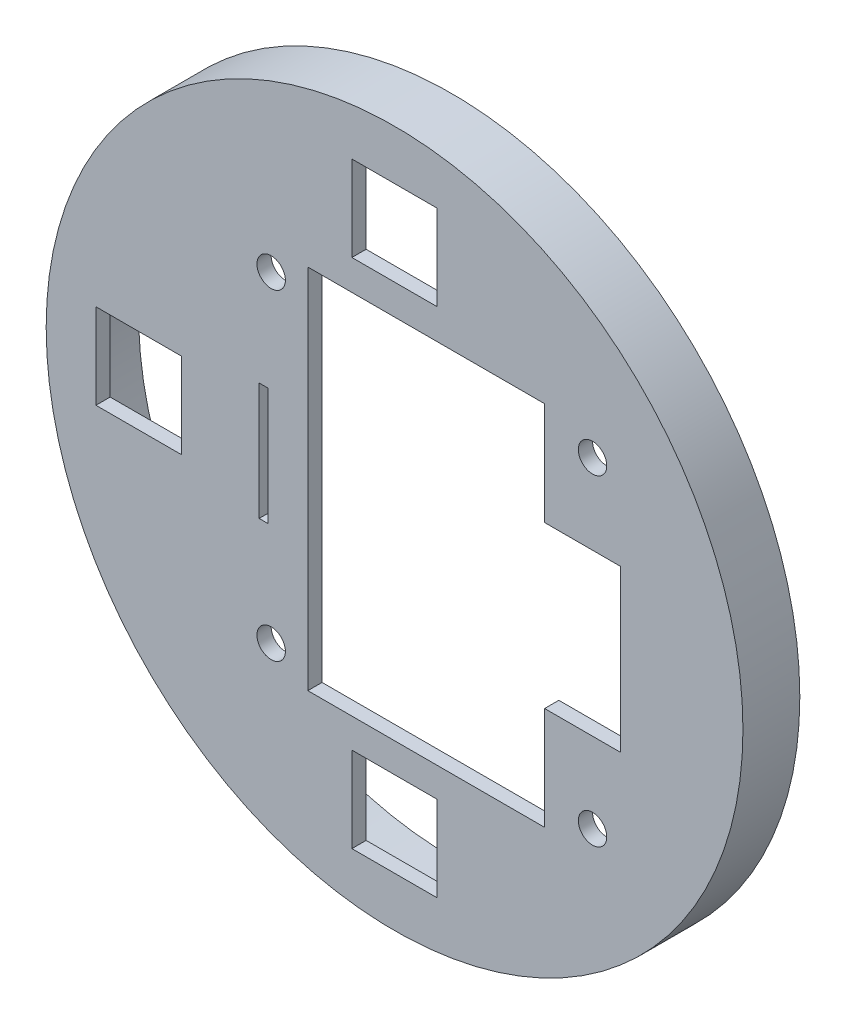
ISO-10303-21;
HEADER;
FILE_DESCRIPTION(('STEP AP214'),'2;1');
FILE_NAME('part.step','',(''),(''),'','','');
FILE_SCHEMA(('AUTOMOTIVE_DESIGN { 1 0 10303 214 1 1 1 1 }'));
ENDSEC;
DATA;
#1=APPLICATION_CONTEXT('core data for automotive mechanical design processes');
#2=APPLICATION_PROTOCOL_DEFINITION('international standard','automotive_design',2000,#1);
#3=PRODUCT_CONTEXT('',#1,'mechanical');
#4=PRODUCT('Part','Part','',(#3));
#5=PRODUCT_RELATED_PRODUCT_CATEGORY('part','',(#4));
#6=PRODUCT_DEFINITION_FORMATION('','',#4);
#7=PRODUCT_DEFINITION_CONTEXT('part definition',#1,'design');
#8=PRODUCT_DEFINITION('design','',#6,#7);
#9=PRODUCT_DEFINITION_SHAPE('','',#8);
#10=(LENGTH_UNIT() NAMED_UNIT(*) SI_UNIT(.MILLI.,.METRE.));
#11=(NAMED_UNIT(*) PLANE_ANGLE_UNIT() SI_UNIT($,.RADIAN.));
#12=(NAMED_UNIT(*) SI_UNIT($,.STERADIAN.) SOLID_ANGLE_UNIT());
#13=UNCERTAINTY_MEASURE_WITH_UNIT(LENGTH_MEASURE(1.E-05),#10,'distance_accuracy_value','');
#14=(GEOMETRIC_REPRESENTATION_CONTEXT(3) GLOBAL_UNCERTAINTY_ASSIGNED_CONTEXT((#13)) GLOBAL_UNIT_ASSIGNED_CONTEXT((#10,
#11,#12)) REPRESENTATION_CONTEXT('',''));
#15=CARTESIAN_POINT('',(0.,0.,0.));
#16=DIRECTION('',(0.,0.,1.));
#17=DIRECTION('',(1.,0.,0.));
#18=AXIS2_PLACEMENT_3D('',#15,#16,#17);
#19=CARTESIAN_POINT('',(0.,0.,0.5));
#20=DIRECTION('',(0.,0.,1.));
#21=DIRECTION('',(1.,0.,0.));
#22=AXIS2_PLACEMENT_3D('',#19,#20,#21);
#23=PLANE('',#22);
#24=DIRECTION('',(-1.,1.31260743015578E-13,0.));
#25=VECTOR('',#24,1.);
#26=CARTESIAN_POINT('',(-1.96891114523368E-12,-15.,0.5));
#27=LINE('',#26,#25);
#28=CARTESIAN_POINT('',(2.99999999999803,-15.0000000000004,0.5));
#29=VERTEX_POINT('',#28);
#30=CARTESIAN_POINT('',(-3.00000000000197,-14.9999999999996,0.5));
#31=VERTEX_POINT('',#30);
#32=EDGE_CURVE('E462',#29,#31,#27,.T.);
#33=ORIENTED_EDGE('',*,*,#32,.T.);
#34=DIRECTION('',(-1.31188462870746E-13,-1.,0.));
#35=VECTOR('',#34,1.);
#36=CARTESIAN_POINT('',(-3.,3.93565388612238E-13,0.5));
#37=LINE('',#36,#35);
#38=CARTESIAN_POINT('',(-3.00000000000275,-20.9999999999996,0.5));
#39=VERTEX_POINT('',#38);
#40=EDGE_CURVE('E509',#31,#39,#37,.T.);
#41=ORIENTED_EDGE('',*,*,#40,.T.);
#42=DIRECTION('',(-1.,1.30682501856919E-13,0.));
#43=VECTOR('',#42,1.);
#44=CARTESIAN_POINT('',(-2.74433253899531E-12,-21.,0.5));
#45=LINE('',#44,#43);
#46=CARTESIAN_POINT('',(2.99999999999725,-21.0000000000004,0.5));
#47=VERTEX_POINT('',#46);
#48=EDGE_CURVE('E504',#47,#39,#45,.T.);
#49=ORIENTED_EDGE('',*,*,#48,.F.);
#50=DIRECTION('',(-1.31188462870746E-13,-1.,0.));
#51=VECTOR('',#50,1.);
#52=CARTESIAN_POINT('',(3.,-3.93565388612239E-13,0.5));
#53=LINE('',#52,#51);
#54=EDGE_CURVE('E500',#29,#47,#53,.T.);
#55=ORIENTED_EDGE('',*,*,#54,.F.);
#56=EDGE_LOOP('',(#33,#41,#49,#55));
#57=FACE_BOUND('',#56,.T.);
#58=DIRECTION('',(0.,1.,0.));
#59=VECTOR('',#58,1.);
#60=CARTESIAN_POINT('',(15.8999999999996,0.,0.5));
#61=LINE('',#60,#59);
#62=CARTESIAN_POINT('',(15.8999999999996,-5.69106739326511,0.5));
#63=VERTEX_POINT('',#62);
#64=CARTESIAN_POINT('',(15.8999999999997,5.63243392589838,0.5));
#65=VERTEX_POINT('',#64);
#66=EDGE_CURVE('E530',#63,#65,#61,.T.);
#67=ORIENTED_EDGE('',*,*,#66,.T.);
#68=DIRECTION('',(1.,0.,0.));
#69=VECTOR('',#68,1.);
#70=CARTESIAN_POINT('',(0.,5.63243392589843,0.5));
#71=LINE('',#70,#69);
#72=CARTESIAN_POINT('',(10.5521111111108,5.6324339258984,0.5));
#73=VERTEX_POINT('',#72);
#74=EDGE_CURVE('E292',#73,#65,#71,.T.);
#75=ORIENTED_EDGE('',*,*,#74,.F.);
#76=DIRECTION('',(0.,-1.,0.));
#77=VECTOR('',#76,1.);
#78=CARTESIAN_POINT('',(10.5521111111108,0.,0.5));
#79=LINE('',#78,#77);
#80=CARTESIAN_POINT('',(10.5521111111108,12.8706832663167,0.5));
#81=VERTEX_POINT('',#80);
#82=EDGE_CURVE('E302',#81,#73,#79,.T.);
#83=ORIENTED_EDGE('',*,*,#82,.F.);
#84=DIRECTION('',(1.,0.,0.));
#85=VECTOR('',#84,1.);
#86=CARTESIAN_POINT('',(0.,12.8706832663167,0.5));
#87=LINE('',#86,#85);
#88=CARTESIAN_POINT('',(-6.09788888888919,12.8706832663167,0.5));
#89=VERTEX_POINT('',#88);
#90=EDGE_CURVE('E289',#89,#81,#87,.T.);
#91=ORIENTED_EDGE('',*,*,#90,.F.);
#92=DIRECTION('',(0.,1.,0.));
#93=VECTOR('',#92,1.);
#94=CARTESIAN_POINT('',(-6.09788888888922,0.,0.5));
#95=LINE('',#94,#93);
#96=CARTESIAN_POINT('',(-6.09788888888924,-12.9293167336833,0.5));
#97=VERTEX_POINT('',#96);
#98=EDGE_CURVE('E296',#97,#89,#95,.T.);
#99=ORIENTED_EDGE('',*,*,#98,.F.);
#100=DIRECTION('',(-1.,0.,0.));
#101=VECTOR('',#100,1.);
#102=CARTESIAN_POINT('',(0.,-12.9293167336833,0.5));
#103=LINE('',#102,#101);
#104=CARTESIAN_POINT('',(10.5521111111107,-12.9293167336833,0.5));
#105=VERTEX_POINT('',#104);
#106=EDGE_CURVE('E286',#105,#97,#103,.T.);
#107=ORIENTED_EDGE('',*,*,#106,.F.);
#108=CARTESIAN_POINT('',(10.5521111111108,-5.6910673932651,0.5));
#109=VERTEX_POINT('',#108);
#110=EDGE_CURVE('E299',#109,#105,#79,.T.);
#111=ORIENTED_EDGE('',*,*,#110,.F.);
#112=DIRECTION('',(-1.,0.,0.));
#113=VECTOR('',#112,1.);
#114=CARTESIAN_POINT('',(0.,-5.69106739326508,0.5));
#115=LINE('',#114,#113);
#116=EDGE_CURVE('E303',#63,#109,#115,.T.);
#117=ORIENTED_EDGE('',*,*,#116,.F.);
#118=EDGE_LOOP('',(#67,#75,#83,#91,#99,#107,#111,#117));
#119=FACE_BOUND('',#118,.T.);
#120=DIRECTION('',(1.,0.,0.));
#121=VECTOR('',#120,1.);
#122=CARTESIAN_POINT('',(0.,-4.15463792916986,0.5));
#123=LINE('',#122,#121);
#124=CARTESIAN_POINT('',(-9.52288888888902,-4.15463788618194,0.499999999998404));
#125=VERTEX_POINT('',#124);
#126=CARTESIAN_POINT('',(-8.89288888888902,-4.15463792916983,0.5));
#127=VERTEX_POINT('',#126);
#128=EDGE_CURVE('E260',#125,#127,#123,.T.);
#129=ORIENTED_EDGE('',*,*,#128,.T.);
#130=DIRECTION('',(0.,1.,0.));
#131=VECTOR('',#130,1.);
#132=CARTESIAN_POINT('',(-8.89288888888901,0.,0.5));
#133=LINE('',#132,#131);
#134=CARTESIAN_POINT('',(-8.892888888889,4.09536209232399,0.5));
#135=VERTEX_POINT('',#134);
#136=EDGE_CURVE('E115',#127,#135,#133,.T.);
#137=ORIENTED_EDGE('',*,*,#136,.T.);
#138=DIRECTION('',(-1.,0.,0.));
#139=VECTOR('',#138,1.);
#140=CARTESIAN_POINT('',(0.,4.09536207083015,0.5));
#141=LINE('',#140,#139);
#142=CARTESIAN_POINT('',(-9.522888888889,4.09536209232399,0.499999999999987));
#143=VERTEX_POINT('',#142);
#144=EDGE_CURVE('E11',#135,#143,#141,.T.);
#145=ORIENTED_EDGE('',*,*,#144,.T.);
#146=DIRECTION('',(0.,-1.,0.));
#147=VECTOR('',#146,1.);
#148=CARTESIAN_POINT('',(-9.52288888888901,0.,0.499999999999987));
#149=LINE('',#148,#147);
#150=EDGE_CURVE('E85',#143,#125,#149,.T.);
#151=ORIENTED_EDGE('',*,*,#150,.T.);
#152=EDGE_LOOP('',(#129,#137,#145,#151));
#153=FACE_BOUND('',#152,.T.);
#154=CARTESIAN_POINT('',(-8.67788888999997,11.2706832663167,0.5));
#155=DIRECTION('',(0.,0.,1.));
#156=DIRECTION('',(1.,0.,0.));
#157=AXIS2_PLACEMENT_3D('',#154,#155,#156);
#158=CIRCLE('',#157,1.00000000106224);
#159=CARTESIAN_POINT('',(-7.67788888893773,11.2706832663167,0.5));
#160=VERTEX_POINT('',#159);
#161=EDGE_CURVE('E312',#160,#160,#158,.T.);
#162=ORIENTED_EDGE('',*,*,#161,.T.);
#163=EDGE_LOOP('',(#162));
#164=FACE_BOUND('',#163,.T.);
#165=CARTESIAN_POINT('',(13.92211111,11.2706832663167,0.5));
#166=DIRECTION('',(0.,0.,1.));
#167=DIRECTION('',(1.,0.,0.));
#168=AXIS2_PLACEMENT_3D('',#165,#166,#167);
#169=CIRCLE('',#168,1.00000000106222);
#170=CARTESIAN_POINT('',(14.9221111110622,11.2706832663167,0.5));
#171=VERTEX_POINT('',#170);
#172=EDGE_CURVE('E336',#171,#171,#169,.T.);
#173=ORIENTED_EDGE('',*,*,#172,.T.);
#174=EDGE_LOOP('',(#173));
#175=FACE_BOUND('',#174,.T.);
#176=CARTESIAN_POINT('',(13.92211111,-11.3293167336833,0.5));
#177=DIRECTION('',(0.,0.,1.));
#178=DIRECTION('',(1.,0.,0.));
#179=AXIS2_PLACEMENT_3D('',#176,#177,#178);
#180=CIRCLE('',#179,1.00000000106218);
#181=CARTESIAN_POINT('',(14.9221111110622,-11.3293167336833,0.5));
#182=VERTEX_POINT('',#181);
#183=EDGE_CURVE('E332',#182,#182,#180,.T.);
#184=ORIENTED_EDGE('',*,*,#183,.T.);
#185=EDGE_LOOP('',(#184));
#186=FACE_BOUND('',#185,.T.);
#187=CARTESIAN_POINT('',(-8.67788888999997,-11.3293167336833,0.5));
#188=DIRECTION('',(0.,0.,1.));
#189=DIRECTION('',(1.,0.,0.));
#190=AXIS2_PLACEMENT_3D('',#187,#188,#189);
#191=CIRCLE('',#190,1.00000000106219);
#192=CARTESIAN_POINT('',(-7.67788888893777,-11.3293167336833,0.5));
#193=VERTEX_POINT('',#192);
#194=EDGE_CURVE('E306',#193,#193,#191,.T.);
#195=ORIENTED_EDGE('',*,*,#194,.T.);
#196=EDGE_LOOP('',(#195));
#197=FACE_BOUND('',#196,.T.);
#198=CARTESIAN_POINT('',(0.,0.,0.5));
#199=DIRECTION('',(0.,0.,1.));
#200=DIRECTION('',(1.,0.,0.));
#201=AXIS2_PLACEMENT_3D('',#198,#199,#200);
#202=CIRCLE('',#201,22.);
#203=CARTESIAN_POINT('',(22.,0.,0.5));
#204=VERTEX_POINT('',#203);
#205=EDGE_CURVE('E328',#204,#204,#202,.T.);
#206=ORIENTED_EDGE('',*,*,#205,.F.);
#207=EDGE_LOOP('',(#206));
#208=FACE_BOUND('',#207,.T.);
#209=DIRECTION('',(1.,0.,0.));
#210=VECTOR('',#209,1.);
#211=CARTESIAN_POINT('',(0.,15.,0.5));
#212=LINE('',#211,#210);
#213=CARTESIAN_POINT('',(-3.,15.,0.5));
#214=VERTEX_POINT('',#213);
#215=CARTESIAN_POINT('',(3.,15.,0.5));
#216=VERTEX_POINT('',#215);
#217=EDGE_CURVE('E187',#214,#216,#212,.T.);
#218=ORIENTED_EDGE('',*,*,#217,.T.);
#219=DIRECTION('',(0.,1.,0.));
#220=VECTOR('',#219,1.);
#221=CARTESIAN_POINT('',(3.,0.,0.5));
#222=LINE('',#221,#220);
#223=CARTESIAN_POINT('',(3.,21.,0.5));
#224=VERTEX_POINT('',#223);
#225=EDGE_CURVE('E202',#216,#224,#222,.T.);
#226=ORIENTED_EDGE('',*,*,#225,.T.);
#227=DIRECTION('',(1.,0.,0.));
#228=VECTOR('',#227,1.);
#229=CARTESIAN_POINT('',(0.,21.,0.5));
#230=LINE('',#229,#228);
#231=CARTESIAN_POINT('',(-3.,21.,0.5));
#232=VERTEX_POINT('',#231);
#233=EDGE_CURVE('E219',#232,#224,#230,.T.);
#234=ORIENTED_EDGE('',*,*,#233,.F.);
#235=DIRECTION('',(0.,1.,0.));
#236=VECTOR('',#235,1.);
#237=CARTESIAN_POINT('',(-3.,0.,0.5));
#238=LINE('',#237,#236);
#239=EDGE_CURVE('E209',#214,#232,#238,.T.);
#240=ORIENTED_EDGE('',*,*,#239,.F.);
#241=EDGE_LOOP('',(#218,#226,#234,#240));
#242=FACE_BOUND('',#241,.T.);
#243=DIRECTION('',(0.,1.,0.));
#244=VECTOR('',#243,1.);
#245=CARTESIAN_POINT('',(-15.,9.80118763926881E-13,0.5));
#246=LINE('',#245,#244);
#247=CARTESIAN_POINT('',(-15.0000000000002,-2.99999999999902,0.5));
#248=VERTEX_POINT('',#247);
#249=CARTESIAN_POINT('',(-14.9999999999998,3.00000000000098,0.5));
#250=VERTEX_POINT('',#249);
#251=EDGE_CURVE('E94',#248,#250,#246,.T.);
#252=ORIENTED_EDGE('',*,*,#251,.T.);
#253=DIRECTION('',(-1.,0.,0.));
#254=VECTOR('',#253,1.);
#255=CARTESIAN_POINT('',(1.96674274088871E-13,3.,0.5));
#256=LINE('',#255,#254);
#257=CARTESIAN_POINT('',(-20.9999999999998,3.00000000000138,0.5));
#258=VERTEX_POINT('',#257);
#259=EDGE_CURVE('E461',#250,#258,#256,.T.);
#260=ORIENTED_EDGE('',*,*,#259,.T.);
#261=DIRECTION('',(0.,1.,0.));
#262=VECTOR('',#261,1.);
#263=CARTESIAN_POINT('',(-21.,1.38430933382949E-12,0.5));
#264=LINE('',#263,#262);
#265=CARTESIAN_POINT('',(-21.0000000000002,-2.99999999999862,0.5));
#266=VERTEX_POINT('',#265);
#267=EDGE_CURVE('E466',#266,#258,#264,.T.);
#268=ORIENTED_EDGE('',*,*,#267,.F.);
#269=DIRECTION('',(-1.,0.,0.));
#270=VECTOR('',#269,1.);
#271=CARTESIAN_POINT('',(-1.9667427408887E-13,-3.,0.5));
#272=LINE('',#271,#270);
#273=EDGE_CURVE('E452',#248,#266,#272,.T.);
#274=ORIENTED_EDGE('',*,*,#273,.F.);
#275=EDGE_LOOP('',(#252,#260,#268,#274));
#276=FACE_BOUND('',#275,.T.);
#277=ADVANCED_FACE('F69',(#57,#119,#153,#164,#175,#186,#197,#208,#242,#276),#23,.F.);
#278=CARTESIAN_POINT('',(0.,0.,1.5));
#279=DIRECTION('',(0.,0.,1.));
#280=DIRECTION('',(1.,0.,0.));
#281=AXIS2_PLACEMENT_3D('',#278,#279,#280);
#282=PLANE('',#281);
#283=DIRECTION('',(0.,1.,0.));
#284=VECTOR('',#283,1.);
#285=CARTESIAN_POINT('',(-8.89288888888901,0.,1.5));
#286=LINE('',#285,#284);
#287=CARTESIAN_POINT('',(-8.89288888888902,-4.15460091450267,1.49999999999557));
#288=VERTEX_POINT('',#287);
#289=CARTESIAN_POINT('',(-8.892888888889,4.09539902562123,1.5));
#290=VERTEX_POINT('',#289);
#291=EDGE_CURVE('E124',#288,#290,#286,.T.);
#292=ORIENTED_EDGE('',*,*,#291,.F.);
#293=DIRECTION('',(1.,0.,0.));
#294=VECTOR('',#293,1.);
#295=CARTESIAN_POINT('',(0.,-4.15460103425467,1.5));
#296=LINE('',#295,#294);
#297=CARTESIAN_POINT('',(-9.52288888888902,-4.15460103425464,1.49999999999999));
#298=VERTEX_POINT('',#297);
#299=EDGE_CURVE('E355',#298,#288,#296,.T.);
#300=ORIENTED_EDGE('',*,*,#299,.F.);
#301=DIRECTION('',(0.,-1.,0.));
#302=VECTOR('',#301,1.);
#303=CARTESIAN_POINT('',(-9.52288888888901,0.,1.49999999999999));
#304=LINE('',#303,#302);
#305=CARTESIAN_POINT('',(-9.522888888889,4.09539902562123,1.49999999999999));
#306=VERTEX_POINT('',#305);
#307=EDGE_CURVE('E359',#306,#298,#304,.T.);
#308=ORIENTED_EDGE('',*,*,#307,.F.);
#309=DIRECTION('',(-1.,0.,0.));
#310=VECTOR('',#309,1.);
#311=CARTESIAN_POINT('',(0.,4.09539896574535,1.5));
#312=LINE('',#311,#310);
#313=EDGE_CURVE('E351',#290,#306,#312,.T.);
#314=ORIENTED_EDGE('',*,*,#313,.F.);
#315=EDGE_LOOP('',(#292,#300,#308,#314));
#316=FACE_BOUND('',#315,.T.);
#317=CARTESIAN_POINT('',(-8.67788888999997,-11.3293167336833,1.5));
#318=DIRECTION('',(0.,0.,1.));
#319=DIRECTION('',(1.,0.,0.));
#320=AXIS2_PLACEMENT_3D('',#317,#318,#319);
#321=CIRCLE('',#320,1.00000000106219);
#322=CARTESIAN_POINT('',(-7.67788888893777,-11.3293167336833,1.5));
#323=VERTEX_POINT('',#322);
#324=EDGE_CURVE('E307',#323,#323,#321,.T.);
#325=ORIENTED_EDGE('',*,*,#324,.F.);
#326=EDGE_LOOP('',(#325));
#327=FACE_BOUND('',#326,.T.);
#328=CARTESIAN_POINT('',(13.92211111,-11.3293167336833,1.5));
#329=DIRECTION('',(0.,0.,1.));
#330=DIRECTION('',(1.,0.,0.));
#331=AXIS2_PLACEMENT_3D('',#328,#329,#330);
#332=CIRCLE('',#331,1.00000000106218);
#333=CARTESIAN_POINT('',(14.9221111110622,-11.3293167336833,1.5));
#334=VERTEX_POINT('',#333);
#335=EDGE_CURVE('E311',#334,#334,#332,.T.);
#336=ORIENTED_EDGE('',*,*,#335,.F.);
#337=EDGE_LOOP('',(#336));
#338=FACE_BOUND('',#337,.T.);
#339=CARTESIAN_POINT('',(13.92211111,11.2706832663167,1.5));
#340=DIRECTION('',(0.,0.,1.));
#341=DIRECTION('',(1.,0.,0.));
#342=AXIS2_PLACEMENT_3D('',#339,#340,#341);
#343=CIRCLE('',#342,1.00000000106222);
#344=CARTESIAN_POINT('',(14.9221111110622,11.2706832663167,1.5));
#345=VERTEX_POINT('',#344);
#346=EDGE_CURVE('E316',#345,#345,#343,.T.);
#347=ORIENTED_EDGE('',*,*,#346,.F.);
#348=EDGE_LOOP('',(#347));
#349=FACE_BOUND('',#348,.T.);
#350=CARTESIAN_POINT('',(-8.67788888999997,11.2706832663167,1.5));
#351=DIRECTION('',(0.,0.,1.));
#352=DIRECTION('',(1.,0.,0.));
#353=AXIS2_PLACEMENT_3D('',#350,#351,#352);
#354=CIRCLE('',#353,1.00000000106224);
#355=CARTESIAN_POINT('',(-7.67788888893773,11.2706832663167,1.5));
#356=VERTEX_POINT('',#355);
#357=EDGE_CURVE('E320',#356,#356,#354,.T.);
#358=ORIENTED_EDGE('',*,*,#357,.F.);
#359=EDGE_LOOP('',(#358));
#360=FACE_BOUND('',#359,.T.);
#361=CARTESIAN_POINT('',(0.,0.,1.5));
#362=DIRECTION('',(0.,0.,1.));
#363=DIRECTION('',(1.,0.,0.));
#364=AXIS2_PLACEMENT_3D('',#361,#362,#363);
#365=CIRCLE('',#364,24.5);
#366=CARTESIAN_POINT('',(24.5,0.,1.5));
#367=VERTEX_POINT('',#366);
#368=EDGE_CURVE('E324',#367,#367,#365,.T.);
#369=ORIENTED_EDGE('',*,*,#368,.T.);
#370=EDGE_LOOP('',(#369));
#371=FACE_BOUND('',#370,.T.);
#372=DIRECTION('',(0.,1.,0.));
#373=VECTOR('',#372,1.);
#374=CARTESIAN_POINT('',(15.8999999999996,-0.0293167336833638,1.49999999999356));
#375=LINE('',#374,#373);
#376=CARTESIAN_POINT('',(15.8999999999996,-5.69106739326511,1.5));
#377=VERTEX_POINT('',#376);
#378=CARTESIAN_POINT('',(15.8999999999997,5.63243392589838,1.5));
#379=VERTEX_POINT('',#378);
#380=EDGE_CURVE('E261',#377,#379,#375,.T.);
#381=ORIENTED_EDGE('',*,*,#380,.F.);
#382=DIRECTION('',(-1.,0.,0.));
#383=VECTOR('',#382,1.);
#384=CARTESIAN_POINT('',(0.,-5.69106739326508,1.5));
#385=LINE('',#384,#383);
#386=CARTESIAN_POINT('',(10.5521111111108,-5.6910673932651,1.5));
#387=VERTEX_POINT('',#386);
#388=EDGE_CURVE('E78',#377,#387,#385,.T.);
#389=ORIENTED_EDGE('',*,*,#388,.T.);
#390=DIRECTION('',(0.,-1.,0.));
#391=VECTOR('',#390,1.);
#392=CARTESIAN_POINT('',(10.5521111111108,0.,1.5));
#393=LINE('',#392,#391);
#394=CARTESIAN_POINT('',(10.5521111111107,-12.9293167336833,1.5));
#395=VERTEX_POINT('',#394);
#396=EDGE_CURVE('E368',#387,#395,#393,.T.);
#397=ORIENTED_EDGE('',*,*,#396,.T.);
#398=DIRECTION('',(-1.,0.,0.));
#399=VECTOR('',#398,1.);
#400=CARTESIAN_POINT('',(0.,-12.9293167336833,1.5));
#401=LINE('',#400,#399);
#402=CARTESIAN_POINT('',(-6.09788888888931,-12.9293167336833,1.5));
#403=VERTEX_POINT('',#402);
#404=EDGE_CURVE('E376',#395,#403,#401,.T.);
#405=ORIENTED_EDGE('',*,*,#404,.T.);
#406=DIRECTION('',(0.,1.,0.));
#407=VECTOR('',#406,1.);
#408=CARTESIAN_POINT('',(-6.09788888888928,0.,1.5));
#409=LINE('',#408,#407);
#410=CARTESIAN_POINT('',(-6.09788888888926,12.8706832663167,1.5));
#411=VERTEX_POINT('',#410);
#412=EDGE_CURVE('E372',#403,#411,#409,.T.);
#413=ORIENTED_EDGE('',*,*,#412,.T.);
#414=DIRECTION('',(1.,0.,0.));
#415=VECTOR('',#414,1.);
#416=CARTESIAN_POINT('',(0.,12.8706832663167,1.5));
#417=LINE('',#416,#415);
#418=CARTESIAN_POINT('',(10.5521111111108,12.8706832663167,1.5));
#419=VERTEX_POINT('',#418);
#420=EDGE_CURVE('E367',#411,#419,#417,.T.);
#421=ORIENTED_EDGE('',*,*,#420,.T.);
#422=CARTESIAN_POINT('',(10.5521111111108,5.6324339258984,1.5));
#423=VERTEX_POINT('',#422);
#424=EDGE_CURVE('E363',#419,#423,#393,.T.);
#425=ORIENTED_EDGE('',*,*,#424,.T.);
#426=DIRECTION('',(1.,0.,0.));
#427=VECTOR('',#426,1.);
#428=CARTESIAN_POINT('',(0.,5.63243392589843,1.5));
#429=LINE('',#428,#427);
#430=EDGE_CURVE('E358',#423,#379,#429,.T.);
#431=ORIENTED_EDGE('',*,*,#430,.T.);
#432=EDGE_LOOP('',(#381,#389,#397,#405,#413,#421,#425,#431));
#433=FACE_BOUND('',#432,.T.);
#434=DIRECTION('',(0.,1.,0.));
#435=VECTOR('',#434,1.);
#436=CARTESIAN_POINT('',(3.,0.,1.5));
#437=LINE('',#436,#435);
#438=CARTESIAN_POINT('',(3.,15.,1.5));
#439=VERTEX_POINT('',#438);
#440=CARTESIAN_POINT('',(3.,21.,1.5));
#441=VERTEX_POINT('',#440);
#442=EDGE_CURVE('E226',#439,#441,#437,.T.);
#443=ORIENTED_EDGE('',*,*,#442,.F.);
#444=DIRECTION('',(1.,0.,0.));
#445=VECTOR('',#444,1.);
#446=CARTESIAN_POINT('',(0.,15.,1.5));
#447=LINE('',#446,#445);
#448=CARTESIAN_POINT('',(-3.,15.,1.5));
#449=VERTEX_POINT('',#448);
#450=EDGE_CURVE('E221',#449,#439,#447,.T.);
#451=ORIENTED_EDGE('',*,*,#450,.F.);
#452=DIRECTION('',(0.,1.,0.));
#453=VECTOR('',#452,1.);
#454=CARTESIAN_POINT('',(-3.,0.,1.5));
#455=LINE('',#454,#453);
#456=CARTESIAN_POINT('',(-3.,21.,1.5));
#457=VERTEX_POINT('',#456);
#458=EDGE_CURVE('E212',#449,#457,#455,.T.);
#459=ORIENTED_EDGE('',*,*,#458,.T.);
#460=DIRECTION('',(1.,0.,0.));
#461=VECTOR('',#460,1.);
#462=CARTESIAN_POINT('',(0.,21.,1.5));
#463=LINE('',#462,#461);
#464=EDGE_CURVE('E234',#457,#441,#463,.T.);
#465=ORIENTED_EDGE('',*,*,#464,.T.);
#466=EDGE_LOOP('',(#443,#451,#459,#465));
#467=FACE_BOUND('',#466,.T.);
#468=DIRECTION('',(-1.31188462870746E-13,-1.,0.));
#469=VECTOR('',#468,1.);
#470=CARTESIAN_POINT('',(-3.,3.93565388612238E-13,1.5));
#471=LINE('',#470,#469);
#472=CARTESIAN_POINT('',(-3.00000000000197,-14.9999999999996,1.5));
#473=VERTEX_POINT('',#472);
#474=CARTESIAN_POINT('',(-3.00000000000275,-20.9999999999996,1.5));
#475=VERTEX_POINT('',#474);
#476=EDGE_CURVE('E428',#473,#475,#471,.T.);
#477=ORIENTED_EDGE('',*,*,#476,.F.);
#478=DIRECTION('',(-1.,1.31260743015578E-13,0.));
#479=VECTOR('',#478,1.);
#480=CARTESIAN_POINT('',(-1.96891114523368E-12,-15.,1.5));
#481=LINE('',#480,#479);
#482=CARTESIAN_POINT('',(2.99999999999803,-15.0000000000004,1.5));
#483=VERTEX_POINT('',#482);
#484=EDGE_CURVE('E505',#483,#473,#481,.T.);
#485=ORIENTED_EDGE('',*,*,#484,.F.);
#486=DIRECTION('',(-1.31188462870746E-13,-1.,0.));
#487=VECTOR('',#486,1.);
#488=CARTESIAN_POINT('',(3.,-3.93565388612239E-13,1.5));
#489=LINE('',#488,#487);
#490=CARTESIAN_POINT('',(2.99999999999725,-21.0000000000004,1.5));
#491=VERTEX_POINT('',#490);
#492=EDGE_CURVE('E499',#483,#491,#489,.T.);
#493=ORIENTED_EDGE('',*,*,#492,.T.);
#494=DIRECTION('',(-1.,1.30682501856919E-13,0.));
#495=VECTOR('',#494,1.);
#496=CARTESIAN_POINT('',(-2.74433253899531E-12,-21.,1.5));
#497=LINE('',#496,#495);
#498=EDGE_CURVE('E519',#491,#475,#497,.T.);
#499=ORIENTED_EDGE('',*,*,#498,.T.);
#500=EDGE_LOOP('',(#477,#485,#493,#499));
#501=FACE_BOUND('',#500,.T.);
#502=DIRECTION('',(-1.,0.,0.));
#503=VECTOR('',#502,1.);
#504=CARTESIAN_POINT('',(1.96674274088871E-13,3.,1.5));
#505=LINE('',#504,#503);
#506=CARTESIAN_POINT('',(-14.9999999999998,3.00000000000098,1.49999999999999));
#507=VERTEX_POINT('',#506);
#508=CARTESIAN_POINT('',(-20.9999999999998,3.00000000000138,1.5));
#509=VERTEX_POINT('',#508);
#510=EDGE_CURVE('E434',#507,#509,#505,.T.);
#511=ORIENTED_EDGE('',*,*,#510,.F.);
#512=DIRECTION('',(0.,1.,0.));
#513=VECTOR('',#512,1.);
#514=CARTESIAN_POINT('',(-15.,9.80118763926881E-13,1.49999999999999));
#515=LINE('',#514,#513);
#516=CARTESIAN_POINT('',(-15.0000000000002,-2.99999999999902,1.49999999999999));
#517=VERTEX_POINT('',#516);
#518=EDGE_CURVE('E437',#517,#507,#515,.T.);
#519=ORIENTED_EDGE('',*,*,#518,.F.);
#520=DIRECTION('',(-1.,0.,0.));
#521=VECTOR('',#520,1.);
#522=CARTESIAN_POINT('',(-1.9667427408887E-13,-3.,1.5));
#523=LINE('',#522,#521);
#524=CARTESIAN_POINT('',(-21.0000000000002,-2.99999999999862,1.5));
#525=VERTEX_POINT('',#524);
#526=EDGE_CURVE('E450',#517,#525,#523,.T.);
#527=ORIENTED_EDGE('',*,*,#526,.T.);
#528=DIRECTION('',(0.,1.,0.));
#529=VECTOR('',#528,1.);
#530=CARTESIAN_POINT('',(-21.,1.38430933382949E-12,1.5));
#531=LINE('',#530,#529);
#532=EDGE_CURVE('E439',#525,#509,#531,.T.);
#533=ORIENTED_EDGE('',*,*,#532,.T.);
#534=EDGE_LOOP('',(#511,#519,#527,#533));
#535=FACE_BOUND('',#534,.T.);
#536=ADVANCED_FACE('F404',(#316,#327,#338,#349,#360,#371,#433,#467,#501,#535),#282,.T.);
#537=CARTESIAN_POINT('',(0.,0.,-2.5));
#538=DIRECTION('',(0.,0.,1.));
#539=DIRECTION('',(1.,0.,0.));
#540=AXIS2_PLACEMENT_3D('',#537,#538,#539);
#541=CYLINDRICAL_SURFACE('',#540,22.);
#542=CARTESIAN_POINT('',(0.,0.,-2.5));
#543=DIRECTION('',(0.,0.,1.));
#544=DIRECTION('',(1.,0.,0.));
#545=AXIS2_PLACEMENT_3D('',#542,#543,#544);
#546=CIRCLE('',#545,22.);
#547=CARTESIAN_POINT('',(22.,0.,-2.5));
#548=VERTEX_POINT('',#547);
#549=EDGE_CURVE('E343',#548,#548,#546,.T.);
#550=ORIENTED_EDGE('',*,*,#549,.F.);
#551=EDGE_LOOP('',(#550));
#552=FACE_BOUND('',#551,.T.);
#553=ORIENTED_EDGE('',*,*,#205,.T.);
#554=EDGE_LOOP('',(#553));
#555=FACE_BOUND('',#554,.T.);
#556=ADVANCED_FACE('F71',(#552,#555),#541,.F.);
#557=CARTESIAN_POINT('',(0.,0.,-2.5));
#558=DIRECTION('',(0.,0.,1.));
#559=DIRECTION('',(1.,0.,0.));
#560=AXIS2_PLACEMENT_3D('',#557,#558,#559);
#561=CYLINDRICAL_SURFACE('',#560,24.5);
#562=CARTESIAN_POINT('',(0.,0.,-2.5));
#563=DIRECTION('',(0.,0.,1.));
#564=DIRECTION('',(1.,0.,0.));
#565=AXIS2_PLACEMENT_3D('',#562,#563,#564);
#566=CIRCLE('',#565,24.5);
#567=CARTESIAN_POINT('',(24.5,0.,-2.5));
#568=VERTEX_POINT('',#567);
#569=EDGE_CURVE('E347',#568,#568,#566,.T.);
#570=ORIENTED_EDGE('',*,*,#569,.T.);
#571=EDGE_LOOP('',(#570));
#572=FACE_BOUND('',#571,.T.);
#573=ORIENTED_EDGE('',*,*,#368,.F.);
#574=EDGE_LOOP('',(#573));
#575=FACE_BOUND('',#574,.T.);
#576=ADVANCED_FACE('F882',(#572,#575),#561,.T.);
#577=CARTESIAN_POINT('',(0.,0.,-2.5));
#578=DIRECTION('',(0.,0.,1.));
#579=DIRECTION('',(1.,0.,0.));
#580=AXIS2_PLACEMENT_3D('',#577,#578,#579);
#581=PLANE('',#580);
#582=ORIENTED_EDGE('',*,*,#549,.T.);
#583=EDGE_LOOP('',(#582));
#584=FACE_BOUND('',#583,.T.);
#585=ORIENTED_EDGE('',*,*,#569,.F.);
#586=EDGE_LOOP('',(#585));
#587=FACE_BOUND('',#586,.T.);
#588=ADVANCED_FACE('F869',(#584,#587),#581,.F.);
#589=CARTESIAN_POINT('',(-8.67788888999997,11.2706832663167,1.5));
#590=DIRECTION('',(0.,0.,-1.));
#591=DIRECTION('',(-1.,0.,0.));
#592=AXIS2_PLACEMENT_3D('',#589,#590,#591);
#593=CYLINDRICAL_SURFACE('',#592,1.00000000106224);
#594=ORIENTED_EDGE('',*,*,#357,.T.);
#595=EDGE_LOOP('',(#594));
#596=FACE_BOUND('',#595,.T.);
#597=ORIENTED_EDGE('',*,*,#161,.F.);
#598=EDGE_LOOP('',(#597));
#599=FACE_BOUND('',#598,.T.);
#600=ADVANCED_FACE('F734',(#596,#599),#593,.F.);
#601=CARTESIAN_POINT('',(13.92211111,11.2706832663167,1.5));
#602=DIRECTION('',(0.,0.,-1.));
#603=DIRECTION('',(-1.,0.,0.));
#604=AXIS2_PLACEMENT_3D('',#601,#602,#603);
#605=CYLINDRICAL_SURFACE('',#604,1.00000000106222);
#606=ORIENTED_EDGE('',*,*,#346,.T.);
#607=EDGE_LOOP('',(#606));
#608=FACE_BOUND('',#607,.T.);
#609=ORIENTED_EDGE('',*,*,#172,.F.);
#610=EDGE_LOOP('',(#609));
#611=FACE_BOUND('',#610,.T.);
#612=ADVANCED_FACE('F868',(#608,#611),#605,.F.);
#613=CARTESIAN_POINT('',(13.92211111,-11.3293167336833,1.5));
#614=DIRECTION('',(0.,0.,-1.));
#615=DIRECTION('',(-1.,0.,0.));
#616=AXIS2_PLACEMENT_3D('',#613,#614,#615);
#617=CYLINDRICAL_SURFACE('',#616,1.00000000106218);
#618=ORIENTED_EDGE('',*,*,#335,.T.);
#619=EDGE_LOOP('',(#618));
#620=FACE_BOUND('',#619,.T.);
#621=ORIENTED_EDGE('',*,*,#183,.F.);
#622=EDGE_LOOP('',(#621));
#623=FACE_BOUND('',#622,.T.);
#624=ADVANCED_FACE('F873',(#620,#623),#617,.F.);
#625=CARTESIAN_POINT('',(-8.67788888999997,-11.3293167336833,1.5));
#626=DIRECTION('',(0.,0.,-1.));
#627=DIRECTION('',(-1.,0.,0.));
#628=AXIS2_PLACEMENT_3D('',#625,#626,#627);
#629=CYLINDRICAL_SURFACE('',#628,1.00000000106219);
#630=ORIENTED_EDGE('',*,*,#324,.T.);
#631=EDGE_LOOP('',(#630));
#632=FACE_BOUND('',#631,.T.);
#633=ORIENTED_EDGE('',*,*,#194,.F.);
#634=EDGE_LOOP('',(#633));
#635=FACE_BOUND('',#634,.T.);
#636=ADVANCED_FACE('F727',(#632,#635),#629,.F.);
#637=CARTESIAN_POINT('',(-9.532888888889,4.09579102396162,12.1263482167359));
#638=DIRECTION('',(0.,0.999999999319383,-3.68949151674615E-05));
#639=DIRECTION('',(0.,3.68949151674615E-05,0.999999999319383));
#640=AXIS2_PLACEMENT_3D('',#637,#638,#639);
#641=PLANE('',#640);
#642=DIRECTION('',(0.,-3.69716792614814E-05,-0.999999999316548));
#643=VECTOR('',#642,1.);
#644=CARTESIAN_POINT('',(-8.892888888889,4.0953990854971,1.49999999999558));
#645=LINE('',#644,#643);
#646=EDGE_CURVE('E249',#290,#135,#645,.T.);
#647=ORIENTED_EDGE('',*,*,#646,.F.);
#648=ORIENTED_EDGE('',*,*,#313,.T.);
#649=DIRECTION('',(0.,3.6971679261481E-05,0.999999999316547));
#650=VECTOR('',#649,1.);
#651=CARTESIAN_POINT('',(-9.522888888889,4.09536211381781,0.499999999998418));
#652=LINE('',#651,#650);
#653=EDGE_CURVE('E266',#143,#306,#652,.T.);
#654=ORIENTED_EDGE('',*,*,#653,.F.);
#655=ORIENTED_EDGE('',*,*,#144,.F.);
#656=EDGE_LOOP('',(#647,#648,#654,#655));
#657=FACE_BOUND('',#656,.T.);
#658=ADVANCED_FACE('F396',(#657),#641,.F.);
#659=CARTESIAN_POINT('',(-9.53288888888902,-4.15466304195275,-0.180657017039142));
#660=DIRECTION('',(0.,-0.999999999319383,3.68949151672057E-05));
#661=DIRECTION('',(-1.,0.,-2.40723049721931E-11));
#662=AXIS2_PLACEMENT_3D('',#659,#660,#661);
#663=PLANE('',#662);
#664=DIRECTION('',(0.,-3.69716792397525E-05,-0.999999999316547));
#665=VECTOR('',#664,1.);
#666=CARTESIAN_POINT('',(-9.52288888888902,-4.15443647031158,5.94784208783622));
#667=LINE('',#666,#665);
#668=EDGE_CURVE('E245',#298,#125,#667,.T.);
#669=ORIENTED_EDGE('',*,*,#668,.F.);
#670=ORIENTED_EDGE('',*,*,#299,.T.);
#671=DIRECTION('',(0.,-3.69716792397525E-05,-0.999999999316547));
#672=VECTOR('',#671,1.);
#673=CARTESIAN_POINT('',(-8.89288888888902,-4.15443647031158,5.94784208783622));
#674=LINE('',#673,#672);
#675=EDGE_CURVE('E241',#288,#127,#674,.T.);
#676=ORIENTED_EDGE('',*,*,#675,.T.);
#677=ORIENTED_EDGE('',*,*,#128,.F.);
#678=EDGE_LOOP('',(#669,#670,#676,#677));
#679=FACE_BOUND('',#678,.T.);
#680=ADVANCED_FACE('F401',(#679),#663,.F.);
#681=CARTESIAN_POINT('',(-9.52288888888901,1.56578760539929,12.1263483281907));
#682=DIRECTION('',(-1.,0.,0.));
#683=DIRECTION('',(0.,0.,-1.));
#684=AXIS2_PLACEMENT_3D('',#681,#682,#683);
#685=PLANE('',#684);
#686=ORIENTED_EDGE('',*,*,#150,.F.);
#687=ORIENTED_EDGE('',*,*,#653,.T.);
#688=ORIENTED_EDGE('',*,*,#307,.T.);
#689=ORIENTED_EDGE('',*,*,#668,.T.);
#690=EDGE_LOOP('',(#686,#687,#688,#689));
#691=FACE_BOUND('',#690,.T.);
#692=ADVANCED_FACE('F402',(#691),#685,.F.);
#693=CARTESIAN_POINT('',(-8.892888888889,1.56578760539929,12.1263483281907));
#694=DIRECTION('',(1.,0.,0.));
#695=DIRECTION('',(0.,-1.,0.));
#696=AXIS2_PLACEMENT_3D('',#693,#694,#695);
#697=PLANE('',#696);
#698=ORIENTED_EDGE('',*,*,#136,.F.);
#699=ORIENTED_EDGE('',*,*,#675,.F.);
#700=ORIENTED_EDGE('',*,*,#291,.T.);
#701=ORIENTED_EDGE('',*,*,#646,.T.);
#702=EDGE_LOOP('',(#698,#699,#700,#701));
#703=FACE_BOUND('',#702,.T.);
#704=ADVANCED_FACE('F393',(#703),#697,.F.);
#705=CARTESIAN_POINT('',(15.8999999999996,-5.69106739326511,0.100000000015997));
#706=DIRECTION('',(0.,1.,0.));
#707=DIRECTION('',(0.,0.,-1.));
#708=AXIS2_PLACEMENT_3D('',#705,#706,#707);
#709=PLANE('',#708);
#710=DIRECTION('',(0.,0.,1.));
#711=VECTOR('',#710,1.);
#712=CARTESIAN_POINT('',(10.5521111111106,-5.6910673932651,0.100000000016004));
#713=LINE('',#712,#711);
#714=EDGE_CURVE('E256',#109,#387,#713,.T.);
#715=ORIENTED_EDGE('',*,*,#714,.T.);
#716=ORIENTED_EDGE('',*,*,#388,.F.);
#717=DIRECTION('',(0.,0.,1.));
#718=VECTOR('',#717,1.);
#719=CARTESIAN_POINT('',(15.8999999999996,-5.69106739326511,-2.5));
#720=LINE('',#719,#718);
#721=EDGE_CURVE('E588',#63,#377,#720,.T.);
#722=ORIENTED_EDGE('',*,*,#721,.F.);
#723=ORIENTED_EDGE('',*,*,#116,.T.);
#724=EDGE_LOOP('',(#715,#716,#722,#723));
#725=FACE_BOUND('',#724,.T.);
#726=ADVANCED_FACE('F596',(#725),#709,.T.);
#727=CARTESIAN_POINT('',(10.5521111111106,-5.6910673932651,0.100000000016004));
#728=DIRECTION('',(-1.,0.,0.));
#729=DIRECTION('',(0.,-1.,0.));
#730=AXIS2_PLACEMENT_3D('',#727,#728,#729);
#731=PLANE('',#730);
#732=ORIENTED_EDGE('',*,*,#82,.T.);
#733=DIRECTION('',(0.,0.,1.));
#734=VECTOR('',#733,1.);
#735=CARTESIAN_POINT('',(10.5521111111106,5.6324339258984,0.100000000016004));
#736=LINE('',#735,#734);
#737=EDGE_CURVE('E254',#73,#423,#736,.T.);
#738=ORIENTED_EDGE('',*,*,#737,.T.);
#739=ORIENTED_EDGE('',*,*,#424,.F.);
#740=DIRECTION('',(0.,0.,1.));
#741=VECTOR('',#740,1.);
#742=CARTESIAN_POINT('',(10.5521111111106,12.8706832663167,0.100000000016004));
#743=LINE('',#742,#741);
#744=EDGE_CURVE('E255',#81,#419,#743,.T.);
#745=ORIENTED_EDGE('',*,*,#744,.F.);
#746=EDGE_LOOP('',(#732,#738,#739,#745));
#747=FACE_BOUND('',#746,.T.);
#748=ADVANCED_FACE('F633',(#747),#731,.T.);
#749=ORIENTED_EDGE('',*,*,#110,.T.);
#750=DIRECTION('',(0.,0.,1.));
#751=VECTOR('',#750,1.);
#752=CARTESIAN_POINT('',(10.5521111111106,-12.9293167336833,0.100000000016004));
#753=LINE('',#752,#751);
#754=EDGE_CURVE('E270',#105,#395,#753,.T.);
#755=ORIENTED_EDGE('',*,*,#754,.T.);
#756=ORIENTED_EDGE('',*,*,#396,.F.);
#757=ORIENTED_EDGE('',*,*,#714,.F.);
#758=EDGE_LOOP('',(#749,#755,#756,#757));
#759=FACE_BOUND('',#758,.T.);
#760=ADVANCED_FACE('F601',(#759),#731,.T.);
#761=CARTESIAN_POINT('',(-6.09788888888924,-12.9293167336833,0.100000000015997));
#762=DIRECTION('',(1.,0.,0.));
#763=DIRECTION('',(0.,0.,1.));
#764=AXIS2_PLACEMENT_3D('',#761,#762,#763);
#765=PLANE('',#764);
#766=ORIENTED_EDGE('',*,*,#98,.T.);
#767=DIRECTION('',(0.,0.,1.));
#768=VECTOR('',#767,1.);
#769=CARTESIAN_POINT('',(-6.09788888888919,12.8706832663167,0.100000000015997));
#770=LINE('',#769,#768);
#771=EDGE_CURVE('E250',#89,#411,#770,.T.);
#772=ORIENTED_EDGE('',*,*,#771,.T.);
#773=ORIENTED_EDGE('',*,*,#412,.F.);
#774=DIRECTION('',(0.,0.,1.));
#775=VECTOR('',#774,1.);
#776=CARTESIAN_POINT('',(-6.09788888888924,-12.9293167336833,0.100000000015997));
#777=LINE('',#776,#775);
#778=EDGE_CURVE('E265',#97,#403,#777,.T.);
#779=ORIENTED_EDGE('',*,*,#778,.F.);
#780=EDGE_LOOP('',(#766,#772,#773,#779));
#781=FACE_BOUND('',#780,.T.);
#782=ADVANCED_FACE('F656',(#781),#765,.T.);
#783=CARTESIAN_POINT('',(10.5521111111106,5.6324339258984,0.100000000016004));
#784=DIRECTION('',(0.,-1.,0.));
#785=DIRECTION('',(-1.,0.,0.));
#786=AXIS2_PLACEMENT_3D('',#783,#784,#785);
#787=PLANE('',#786);
#788=ORIENTED_EDGE('',*,*,#74,.T.);
#789=DIRECTION('',(0.,0.,1.));
#790=VECTOR('',#789,1.);
#791=CARTESIAN_POINT('',(15.8999999999997,5.63243392589838,-2.5));
#792=LINE('',#791,#790);
#793=EDGE_CURVE('E581',#65,#379,#792,.T.);
#794=ORIENTED_EDGE('',*,*,#793,.T.);
#795=ORIENTED_EDGE('',*,*,#430,.F.);
#796=ORIENTED_EDGE('',*,*,#737,.F.);
#797=EDGE_LOOP('',(#788,#794,#795,#796));
#798=FACE_BOUND('',#797,.T.);
#799=ADVANCED_FACE('F582',(#798),#787,.T.);
#800=CARTESIAN_POINT('',(-6.09788888888919,12.8706832663167,0.100000000015997));
#801=DIRECTION('',(0.,-1.,0.));
#802=DIRECTION('',(-1.,0.,0.));
#803=AXIS2_PLACEMENT_3D('',#800,#801,#802);
#804=PLANE('',#803);
#805=ORIENTED_EDGE('',*,*,#90,.T.);
#806=ORIENTED_EDGE('',*,*,#744,.T.);
#807=ORIENTED_EDGE('',*,*,#420,.F.);
#808=ORIENTED_EDGE('',*,*,#771,.F.);
#809=EDGE_LOOP('',(#805,#806,#807,#808));
#810=FACE_BOUND('',#809,.T.);
#811=ADVANCED_FACE('F675',(#810),#804,.T.);
#812=CARTESIAN_POINT('',(10.5521111111106,-12.9293167336833,0.100000000016004));
#813=DIRECTION('',(0.,1.,0.));
#814=DIRECTION('',(0.,0.,-1.));
#815=AXIS2_PLACEMENT_3D('',#812,#813,#814);
#816=PLANE('',#815);
#817=ORIENTED_EDGE('',*,*,#106,.T.);
#818=ORIENTED_EDGE('',*,*,#778,.T.);
#819=ORIENTED_EDGE('',*,*,#404,.F.);
#820=ORIENTED_EDGE('',*,*,#754,.F.);
#821=EDGE_LOOP('',(#817,#818,#819,#820));
#822=FACE_BOUND('',#821,.T.);
#823=ADVANCED_FACE('F686',(#822),#816,.T.);
#824=CARTESIAN_POINT('',(0.,15.,1.5));
#825=DIRECTION('',(0.,1.,0.));
#826=DIRECTION('',(0.,0.,1.));
#827=AXIS2_PLACEMENT_3D('',#824,#825,#826);
#828=PLANE('',#827);
#829=ORIENTED_EDGE('',*,*,#217,.F.);
#830=DIRECTION('',(0.,0.,-1.));
#831=VECTOR('',#830,1.);
#832=CARTESIAN_POINT('',(-3.,15.,1.5));
#833=LINE('',#832,#831);
#834=EDGE_CURVE('E192',#449,#214,#833,.T.);
#835=ORIENTED_EDGE('',*,*,#834,.F.);
#836=ORIENTED_EDGE('',*,*,#450,.T.);
#837=DIRECTION('',(0.,0.,-1.));
#838=VECTOR('',#837,1.);
#839=CARTESIAN_POINT('',(3.,15.,1.5));
#840=LINE('',#839,#838);
#841=EDGE_CURVE('E196',#439,#216,#840,.T.);
#842=ORIENTED_EDGE('',*,*,#841,.T.);
#843=EDGE_LOOP('',(#829,#835,#836,#842));
#844=FACE_BOUND('',#843,.T.);
#845=ADVANCED_FACE('F189',(#844),#828,.T.);
#846=CARTESIAN_POINT('',(3.,0.,1.5));
#847=DIRECTION('',(-1.,0.,0.));
#848=DIRECTION('',(0.,0.,1.));
#849=AXIS2_PLACEMENT_3D('',#846,#847,#848);
#850=PLANE('',#849);
#851=ORIENTED_EDGE('',*,*,#225,.F.);
#852=ORIENTED_EDGE('',*,*,#841,.F.);
#853=ORIENTED_EDGE('',*,*,#442,.T.);
#854=DIRECTION('',(0.,0.,-1.));
#855=VECTOR('',#854,1.);
#856=CARTESIAN_POINT('',(3.,21.,1.5));
#857=LINE('',#856,#855);
#858=EDGE_CURVE('E529',#441,#224,#857,.T.);
#859=ORIENTED_EDGE('',*,*,#858,.T.);
#860=EDGE_LOOP('',(#851,#852,#853,#859));
#861=FACE_BOUND('',#860,.T.);
#862=ADVANCED_FACE('F545',(#861),#850,.T.);
#863=CARTESIAN_POINT('',(0.,21.,1.5));
#864=DIRECTION('',(0.,1.,0.));
#865=DIRECTION('',(0.,0.,1.));
#866=AXIS2_PLACEMENT_3D('',#863,#864,#865);
#867=PLANE('',#866);
#868=ORIENTED_EDGE('',*,*,#233,.T.);
#869=ORIENTED_EDGE('',*,*,#858,.F.);
#870=ORIENTED_EDGE('',*,*,#464,.F.);
#871=DIRECTION('',(0.,0.,-1.));
#872=VECTOR('',#871,1.);
#873=CARTESIAN_POINT('',(-3.,21.,1.5));
#874=LINE('',#873,#872);
#875=EDGE_CURVE('E215',#457,#232,#874,.T.);
#876=ORIENTED_EDGE('',*,*,#875,.T.);
#877=EDGE_LOOP('',(#868,#869,#870,#876));
#878=FACE_BOUND('',#877,.T.);
#879=ADVANCED_FACE('F536',(#878),#867,.F.);
#880=CARTESIAN_POINT('',(-3.,0.,1.5));
#881=DIRECTION('',(-1.,0.,0.));
#882=DIRECTION('',(0.,0.,1.));
#883=AXIS2_PLACEMENT_3D('',#880,#881,#882);
#884=PLANE('',#883);
#885=ORIENTED_EDGE('',*,*,#239,.T.);
#886=ORIENTED_EDGE('',*,*,#875,.F.);
#887=ORIENTED_EDGE('',*,*,#458,.F.);
#888=ORIENTED_EDGE('',*,*,#834,.T.);
#889=EDGE_LOOP('',(#885,#886,#887,#888));
#890=FACE_BOUND('',#889,.T.);
#891=ADVANCED_FACE('F206',(#890),#884,.F.);
#892=CARTESIAN_POINT('',(-1.96891114523368E-12,-15.,1.5));
#893=DIRECTION('',(-1.31260743015578E-13,-1.,0.));
#894=DIRECTION('',(1.,-1.31260743015578E-13,0.));
#895=AXIS2_PLACEMENT_3D('',#892,#893,#894);
#896=PLANE('',#895);
#897=ORIENTED_EDGE('',*,*,#32,.F.);
#898=DIRECTION('',(0.,0.,-1.));
#899=VECTOR('',#898,1.);
#900=CARTESIAN_POINT('',(2.99999999999803,-15.0000000000004,1.5));
#901=LINE('',#900,#899);
#902=EDGE_CURVE('E495',#483,#29,#901,.T.);
#903=ORIENTED_EDGE('',*,*,#902,.F.);
#904=ORIENTED_EDGE('',*,*,#484,.T.);
#905=DIRECTION('',(0.,0.,-1.));
#906=VECTOR('',#905,1.);
#907=CARTESIAN_POINT('',(-3.00000000000197,-14.9999999999996,1.5));
#908=LINE('',#907,#906);
#909=EDGE_CURVE('E201',#473,#31,#908,.T.);
#910=ORIENTED_EDGE('',*,*,#909,.T.);
#911=EDGE_LOOP('',(#897,#903,#904,#910));
#912=FACE_BOUND('',#911,.T.);
#913=ADVANCED_FACE('F797',(#912),#896,.T.);
#914=CARTESIAN_POINT('',(-3.,3.93565388612238E-13,1.5));
#915=DIRECTION('',(1.,-1.31188462870746E-13,0.));
#916=DIRECTION('',(1.31188462870746E-13,1.,0.));
#917=AXIS2_PLACEMENT_3D('',#914,#915,#916);
#918=PLANE('',#917);
#919=ORIENTED_EDGE('',*,*,#40,.F.);
#920=ORIENTED_EDGE('',*,*,#909,.F.);
#921=ORIENTED_EDGE('',*,*,#476,.T.);
#922=DIRECTION('',(0.,0.,-1.));
#923=VECTOR('',#922,1.);
#924=CARTESIAN_POINT('',(-3.00000000000275,-20.9999999999996,1.5));
#925=LINE('',#924,#923);
#926=EDGE_CURVE('E487',#475,#39,#925,.T.);
#927=ORIENTED_EDGE('',*,*,#926,.T.);
#928=EDGE_LOOP('',(#919,#920,#921,#927));
#929=FACE_BOUND('',#928,.T.);
#930=ADVANCED_FACE('F804',(#929),#918,.T.);
#931=CARTESIAN_POINT('',(-2.74433253899531E-12,-21.,1.5));
#932=DIRECTION('',(-1.30682501856919E-13,-1.,0.));
#933=DIRECTION('',(1.,-1.30682501856919E-13,0.));
#934=AXIS2_PLACEMENT_3D('',#931,#932,#933);
#935=PLANE('',#934);
#936=ORIENTED_EDGE('',*,*,#48,.T.);
#937=ORIENTED_EDGE('',*,*,#926,.F.);
#938=ORIENTED_EDGE('',*,*,#498,.F.);
#939=DIRECTION('',(0.,0.,-1.));
#940=VECTOR('',#939,1.);
#941=CARTESIAN_POINT('',(2.99999999999725,-21.0000000000004,1.5));
#942=LINE('',#941,#940);
#943=EDGE_CURVE('E491',#491,#47,#942,.T.);
#944=ORIENTED_EDGE('',*,*,#943,.T.);
#945=EDGE_LOOP('',(#936,#937,#938,#944));
#946=FACE_BOUND('',#945,.T.);
#947=ADVANCED_FACE('F812',(#946),#935,.F.);
#948=CARTESIAN_POINT('',(3.,-3.93565388612239E-13,1.5));
#949=DIRECTION('',(1.,-1.31188462870746E-13,0.));
#950=DIRECTION('',(1.31188462870746E-13,1.,0.));
#951=AXIS2_PLACEMENT_3D('',#948,#949,#950);
#952=PLANE('',#951);
#953=ORIENTED_EDGE('',*,*,#54,.T.);
#954=ORIENTED_EDGE('',*,*,#943,.F.);
#955=ORIENTED_EDGE('',*,*,#492,.F.);
#956=ORIENTED_EDGE('',*,*,#902,.T.);
#957=EDGE_LOOP('',(#953,#954,#955,#956));
#958=FACE_BOUND('',#957,.T.);
#959=ADVANCED_FACE('F820',(#958),#952,.F.);
#960=CARTESIAN_POINT('',(-15.,9.80118763926881E-13,1.49999999999999));
#961=DIRECTION('',(-1.,0.,0.));
#962=DIRECTION('',(0.,-1.,0.));
#963=AXIS2_PLACEMENT_3D('',#960,#961,#962);
#964=PLANE('',#963);
#965=ORIENTED_EDGE('',*,*,#251,.F.);
#966=DIRECTION('',(0.,0.,-1.));
#967=VECTOR('',#966,1.);
#968=CARTESIAN_POINT('',(-15.0000000000002,-2.99999999999902,1.49999999999999));
#969=LINE('',#968,#967);
#970=EDGE_CURVE('E458',#517,#248,#969,.T.);
#971=ORIENTED_EDGE('',*,*,#970,.F.);
#972=ORIENTED_EDGE('',*,*,#518,.T.);
#973=DIRECTION('',(0.,0.,-1.));
#974=VECTOR('',#973,1.);
#975=CARTESIAN_POINT('',(-14.9999999999998,3.00000000000098,1.49999999999999));
#976=LINE('',#975,#974);
#977=EDGE_CURVE('E246',#507,#250,#976,.T.);
#978=ORIENTED_EDGE('',*,*,#977,.T.);
#979=EDGE_LOOP('',(#965,#971,#972,#978));
#980=FACE_BOUND('',#979,.T.);
#981=ADVANCED_FACE('F828',(#980),#964,.T.);
#982=CARTESIAN_POINT('',(1.96674274088871E-13,3.,1.5));
#983=DIRECTION('',(0.,-1.,0.));
#984=DIRECTION('',(1.,0.,0.));
#985=AXIS2_PLACEMENT_3D('',#982,#983,#984);
#986=PLANE('',#985);
#987=ORIENTED_EDGE('',*,*,#259,.F.);
#988=ORIENTED_EDGE('',*,*,#977,.F.);
#989=ORIENTED_EDGE('',*,*,#510,.T.);
#990=DIRECTION('',(0.,0.,-1.));
#991=VECTOR('',#990,1.);
#992=CARTESIAN_POINT('',(-20.9999999999998,3.00000000000138,1.5));
#993=LINE('',#992,#991);
#994=EDGE_CURVE('E479',#509,#258,#993,.T.);
#995=ORIENTED_EDGE('',*,*,#994,.T.);
#996=EDGE_LOOP('',(#987,#988,#989,#995));
#997=FACE_BOUND('',#996,.T.);
#998=ADVANCED_FACE('F836',(#997),#986,.T.);
#999=CARTESIAN_POINT('',(-21.,1.38430933382949E-12,1.5));
#1000=DIRECTION('',(-1.,0.,0.));
#1001=DIRECTION('',(0.,-1.,0.));
#1002=AXIS2_PLACEMENT_3D('',#999,#1000,#1001);
#1003=PLANE('',#1002);
#1004=ORIENTED_EDGE('',*,*,#267,.T.);
#1005=ORIENTED_EDGE('',*,*,#994,.F.);
#1006=ORIENTED_EDGE('',*,*,#532,.F.);
#1007=DIRECTION('',(0.,0.,-1.));
#1008=VECTOR('',#1007,1.);
#1009=CARTESIAN_POINT('',(-21.0000000000002,-2.99999999999862,1.5));
#1010=LINE('',#1009,#1008);
#1011=EDGE_CURVE('E475',#525,#266,#1010,.T.);
#1012=ORIENTED_EDGE('',*,*,#1011,.T.);
#1013=EDGE_LOOP('',(#1004,#1005,#1006,#1012));
#1014=FACE_BOUND('',#1013,.T.);
#1015=ADVANCED_FACE('F843',(#1014),#1003,.F.);
#1016=CARTESIAN_POINT('',(-1.9667427408887E-13,-3.,1.5));
#1017=DIRECTION('',(0.,-1.,0.));
#1018=DIRECTION('',(1.,0.,0.));
#1019=AXIS2_PLACEMENT_3D('',#1016,#1017,#1018);
#1020=PLANE('',#1019);
#1021=ORIENTED_EDGE('',*,*,#273,.T.);
#1022=ORIENTED_EDGE('',*,*,#1011,.F.);
#1023=ORIENTED_EDGE('',*,*,#526,.F.);
#1024=ORIENTED_EDGE('',*,*,#970,.T.);
#1025=EDGE_LOOP('',(#1021,#1022,#1023,#1024));
#1026=FACE_BOUND('',#1025,.T.);
#1027=ADVANCED_FACE('F850',(#1026),#1020,.F.);
#1028=CARTESIAN_POINT('',(15.8999999999997,5.63243392589838,-2.5));
#1029=DIRECTION('',(1.,0.,0.));
#1030=DIRECTION('',(0.,1.,0.));
#1031=AXIS2_PLACEMENT_3D('',#1028,#1029,#1030);
#1032=PLANE('',#1031);
#1033=ORIENTED_EDGE('',*,*,#721,.T.);
#1034=ORIENTED_EDGE('',*,*,#380,.T.);
#1035=ORIENTED_EDGE('',*,*,#793,.F.);
#1036=ORIENTED_EDGE('',*,*,#66,.F.);
#1037=EDGE_LOOP('',(#1033,#1034,#1035,#1036));
#1038=FACE_BOUND('',#1037,.T.);
#1039=ADVANCED_FACE('F590',(#1038),#1032,.F.);
#1040=CLOSED_SHELL('',(#277,#536,#556,#576,#588,#600,#612,#624,#636,#658,#680,#692,#704,#726,
#748,#760,#782,#799,#811,#823,#845,#862,#879,#891,#913,#930,#947,#959,#981,#998,#1015,#1027,#1039));
#1041=MANIFOLD_SOLID_BREP('B2',#1040);
#1042=ADVANCED_BREP_SHAPE_REPRESENTATION('',(#18,#1041),#14);
#1043=SHAPE_DEFINITION_REPRESENTATION(#9,#1042);
ENDSEC;
END-ISO-10303-21;
